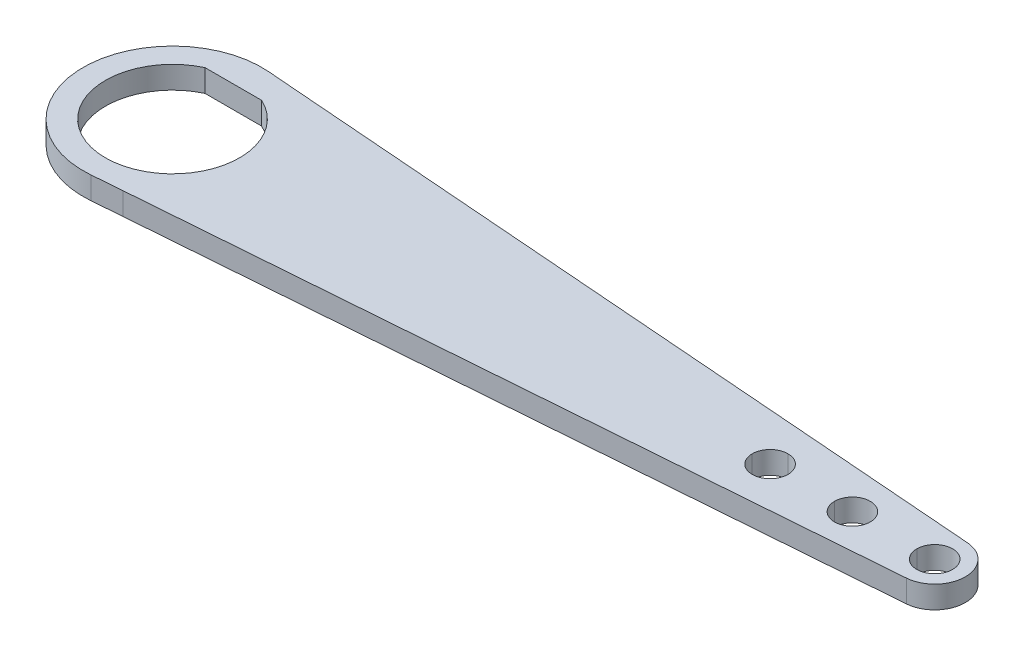
ISO-10303-21;
HEADER;
FILE_DESCRIPTION(('STEP AP214'),'2;1');
FILE_NAME('part.step','',(''),(''),'','','');
FILE_SCHEMA(('AUTOMOTIVE_DESIGN { 1 0 10303 214 1 1 1 1 }'));
ENDSEC;
DATA;
#1=APPLICATION_CONTEXT('core data for automotive mechanical design processes');
#2=APPLICATION_PROTOCOL_DEFINITION('international standard','automotive_design',2000,#1);
#3=PRODUCT_CONTEXT('',#1,'mechanical');
#4=PRODUCT('Part','Part','',(#3));
#5=PRODUCT_RELATED_PRODUCT_CATEGORY('part','',(#4));
#6=PRODUCT_DEFINITION_FORMATION('','',#4);
#7=PRODUCT_DEFINITION_CONTEXT('part definition',#1,'design');
#8=PRODUCT_DEFINITION('design','',#6,#7);
#9=PRODUCT_DEFINITION_SHAPE('','',#8);
#10=(LENGTH_UNIT() NAMED_UNIT(*) SI_UNIT(.MILLI.,.METRE.));
#11=(NAMED_UNIT(*) PLANE_ANGLE_UNIT() SI_UNIT($,.RADIAN.));
#12=(NAMED_UNIT(*) SI_UNIT($,.STERADIAN.) SOLID_ANGLE_UNIT());
#13=UNCERTAINTY_MEASURE_WITH_UNIT(LENGTH_MEASURE(1.E-05),#10,'distance_accuracy_value','');
#14=(GEOMETRIC_REPRESENTATION_CONTEXT(3) GLOBAL_UNCERTAINTY_ASSIGNED_CONTEXT((#13)) GLOBAL_UNIT_ASSIGNED_CONTEXT((#10,
#11,#12)) REPRESENTATION_CONTEXT('',''));
#15=CARTESIAN_POINT('',(0.,0.,0.));
#16=DIRECTION('',(0.,0.,1.));
#17=DIRECTION('',(1.,0.,0.));
#18=AXIS2_PLACEMENT_3D('',#15,#16,#17);
#19=CARTESIAN_POINT('',(84.836,3.175,0.));
#20=DIRECTION('',(0.,-1.,0.));
#21=DIRECTION('',(0.,0.,-1.));
#22=AXIS2_PLACEMENT_3D('',#19,#20,#21);
#23=CYLINDRICAL_SURFACE('',#22,2.54);
#24=CARTESIAN_POINT('',(84.836,0.,0.));
#25=DIRECTION('',(0.,1.,0.));
#26=DIRECTION('',(0.,0.,1.));
#27=AXIS2_PLACEMENT_3D('',#24,#25,#26);
#28=CIRCLE('',#27,2.54);
#29=CARTESIAN_POINT('',(84.836,0.,-2.54));
#30=VERTEX_POINT('',#29);
#31=CARTESIAN_POINT('',(82.296,0.,0.));
#32=VERTEX_POINT('',#31);
#33=EDGE_CURVE('E191',#30,#32,#28,.T.);
#34=ORIENTED_EDGE('',*,*,#33,.F.);
#35=DIRECTION('',(0.,-1.,0.));
#36=VECTOR('',#35,1.);
#37=CARTESIAN_POINT('',(84.836,3.175,-2.54));
#38=LINE('',#37,#36);
#39=CARTESIAN_POINT('',(84.836,3.175,-2.54));
#40=VERTEX_POINT('',#39);
#41=EDGE_CURVE('E11',#30,#40,#38,.F.);
#42=ORIENTED_EDGE('',*,*,#41,.T.);
#43=CARTESIAN_POINT('',(84.836,3.175,0.));
#44=DIRECTION('',(0.,1.,0.));
#45=DIRECTION('',(0.,0.,1.));
#46=AXIS2_PLACEMENT_3D('',#43,#44,#45);
#47=CIRCLE('',#46,2.54);
#48=CARTESIAN_POINT('',(82.296,3.175,0.));
#49=VERTEX_POINT('',#48);
#50=EDGE_CURVE('E185',#40,#49,#47,.T.);
#51=ORIENTED_EDGE('',*,*,#50,.T.);
#52=DIRECTION('',(0.,-1.,0.));
#53=VECTOR('',#52,1.);
#54=CARTESIAN_POINT('',(82.296,3.175,0.));
#55=LINE('',#54,#53);
#56=EDGE_CURVE('E259',#49,#32,#55,.T.);
#57=ORIENTED_EDGE('',*,*,#56,.T.);
#58=EDGE_LOOP('',(#34,#42,#51,#57));
#59=FACE_BOUND('',#58,.T.);
#60=ADVANCED_FACE('F49',(#59),#23,.F.);
#61=CARTESIAN_POINT('',(84.836,3.175,2.54));
#62=VERTEX_POINT('',#61);
#63=EDGE_CURVE('E186',#49,#62,#47,.T.);
#64=ORIENTED_EDGE('',*,*,#63,.T.);
#65=DIRECTION('',(0.,-1.,0.));
#66=VECTOR('',#65,1.);
#67=CARTESIAN_POINT('',(84.836,3.175,2.54));
#68=LINE('',#67,#66);
#69=CARTESIAN_POINT('',(84.836,0.,2.54));
#70=VERTEX_POINT('',#69);
#71=EDGE_CURVE('E58',#62,#70,#68,.T.);
#72=ORIENTED_EDGE('',*,*,#71,.T.);
#73=EDGE_CURVE('E192',#32,#70,#28,.T.);
#74=ORIENTED_EDGE('',*,*,#73,.F.);
#75=ORIENTED_EDGE('',*,*,#56,.F.);
#76=EDGE_LOOP('',(#64,#72,#74,#75));
#77=FACE_BOUND('',#76,.T.);
#78=ADVANCED_FACE('F281',(#77),#23,.F.);
#79=CARTESIAN_POINT('',(108.204,3.175,0.));
#80=DIRECTION('',(0.,-1.,0.));
#81=DIRECTION('',(0.,0.,-1.));
#82=AXIS2_PLACEMENT_3D('',#79,#80,#81);
#83=CYLINDRICAL_SURFACE('',#82,2.54);
#84=CARTESIAN_POINT('',(108.204,3.175,0.));
#85=DIRECTION('',(0.,1.,0.));
#86=DIRECTION('',(0.,0.,1.));
#87=AXIS2_PLACEMENT_3D('',#84,#85,#86);
#88=CIRCLE('',#87,2.54);
#89=CARTESIAN_POINT('',(110.744,3.175,0.));
#90=VERTEX_POINT('',#89);
#91=CARTESIAN_POINT('',(105.664,3.175,0.));
#92=VERTEX_POINT('',#91);
#93=EDGE_CURVE('E193',#90,#92,#88,.T.);
#94=ORIENTED_EDGE('',*,*,#93,.T.);
#95=DIRECTION('',(0.,-1.,0.));
#96=VECTOR('',#95,1.);
#97=CARTESIAN_POINT('',(105.664,3.175,0.));
#98=LINE('',#97,#96);
#99=CARTESIAN_POINT('',(105.664,0.,0.));
#100=VERTEX_POINT('',#99);
#101=EDGE_CURVE('E272',#92,#100,#98,.T.);
#102=ORIENTED_EDGE('',*,*,#101,.T.);
#103=CARTESIAN_POINT('',(108.204,0.,0.));
#104=DIRECTION('',(0.,1.,0.));
#105=DIRECTION('',(0.,0.,1.));
#106=AXIS2_PLACEMENT_3D('',#103,#104,#105);
#107=CIRCLE('',#106,2.54);
#108=CARTESIAN_POINT('',(110.744,0.,0.));
#109=VERTEX_POINT('',#108);
#110=EDGE_CURVE('E198',#109,#100,#107,.T.);
#111=ORIENTED_EDGE('',*,*,#110,.F.);
#112=DIRECTION('',(0.,-1.,0.));
#113=VECTOR('',#112,1.);
#114=CARTESIAN_POINT('',(110.744,3.175,0.));
#115=LINE('',#114,#113);
#116=EDGE_CURVE('E269',#109,#90,#115,.F.);
#117=ORIENTED_EDGE('',*,*,#116,.T.);
#118=EDGE_LOOP('',(#94,#102,#111,#117));
#119=FACE_BOUND('',#118,.T.);
#120=ADVANCED_FACE('F304',(#119),#83,.F.);
#121=CARTESIAN_POINT('',(96.52,3.175,0.));
#122=DIRECTION('',(0.,-1.,0.));
#123=DIRECTION('',(0.,0.,-1.));
#124=AXIS2_PLACEMENT_3D('',#121,#122,#123);
#125=CYLINDRICAL_SURFACE('',#124,2.54);
#126=CARTESIAN_POINT('',(96.52,3.175,0.));
#127=DIRECTION('',(0.,1.,0.));
#128=DIRECTION('',(0.,0.,1.));
#129=AXIS2_PLACEMENT_3D('',#126,#127,#128);
#130=CIRCLE('',#129,2.54);
#131=CARTESIAN_POINT('',(99.06,3.175,0.));
#132=VERTEX_POINT('',#131);
#133=CARTESIAN_POINT('',(93.98,3.175,0.));
#134=VERTEX_POINT('',#133);
#135=EDGE_CURVE('E201',#132,#134,#130,.T.);
#136=ORIENTED_EDGE('',*,*,#135,.T.);
#137=DIRECTION('',(0.,-1.,0.));
#138=VECTOR('',#137,1.);
#139=CARTESIAN_POINT('',(93.98,3.175,0.));
#140=LINE('',#139,#138);
#141=CARTESIAN_POINT('',(93.98,0.,0.));
#142=VERTEX_POINT('',#141);
#143=EDGE_CURVE('E266',#134,#142,#140,.T.);
#144=ORIENTED_EDGE('',*,*,#143,.T.);
#145=CARTESIAN_POINT('',(96.52,0.,0.));
#146=DIRECTION('',(0.,1.,0.));
#147=DIRECTION('',(0.,0.,1.));
#148=AXIS2_PLACEMENT_3D('',#145,#146,#147);
#149=CIRCLE('',#148,2.54);
#150=CARTESIAN_POINT('',(99.06,0.,0.));
#151=VERTEX_POINT('',#150);
#152=EDGE_CURVE('E206',#151,#142,#149,.T.);
#153=ORIENTED_EDGE('',*,*,#152,.F.);
#154=DIRECTION('',(0.,-1.,0.));
#155=VECTOR('',#154,1.);
#156=CARTESIAN_POINT('',(99.06,3.175,0.));
#157=LINE('',#156,#155);
#158=EDGE_CURVE('E263',#151,#132,#157,.F.);
#159=ORIENTED_EDGE('',*,*,#158,.T.);
#160=EDGE_LOOP('',(#136,#144,#153,#159));
#161=FACE_BOUND('',#160,.T.);
#162=ADVANCED_FACE('F297',(#161),#125,.F.);
#163=ORIENTED_EDGE('',*,*,#41,.F.);
#164=CARTESIAN_POINT('',(87.376,0.,0.));
#165=VERTEX_POINT('',#164);
#166=EDGE_CURVE('E187',#165,#30,#28,.T.);
#167=ORIENTED_EDGE('',*,*,#166,.F.);
#168=DIRECTION('',(0.,-1.,0.));
#169=VECTOR('',#168,1.);
#170=CARTESIAN_POINT('',(87.376,3.175,0.));
#171=LINE('',#170,#169);
#172=CARTESIAN_POINT('',(87.376,3.175,0.));
#173=VERTEX_POINT('',#172);
#174=EDGE_CURVE('E255',#165,#173,#171,.F.);
#175=ORIENTED_EDGE('',*,*,#174,.T.);
#176=EDGE_CURVE('E182',#173,#40,#47,.T.);
#177=ORIENTED_EDGE('',*,*,#176,.T.);
#178=EDGE_LOOP('',(#163,#167,#175,#177));
#179=FACE_BOUND('',#178,.T.);
#180=ADVANCED_FACE('F295',(#179),#23,.F.);
#181=CARTESIAN_POINT('',(61.7867275580791,3.175,-743.516676446642));
#182=DIRECTION('',(0.,-1.,0.));
#183=DIRECTION('',(0.,0.,-1.));
#184=AXIS2_PLACEMENT_3D('',#181,#182,#183);
#185=PLANE('',#184);
#186=ORIENTED_EDGE('',*,*,#176,.F.);
#187=EDGE_CURVE('E190',#62,#173,#47,.T.);
#188=ORIENTED_EDGE('',*,*,#187,.F.);
#189=ORIENTED_EDGE('',*,*,#63,.F.);
#190=ORIENTED_EDGE('',*,*,#50,.F.);
#191=EDGE_LOOP('',(#186,#188,#189,#190));
#192=FACE_BOUND('',#191,.T.);
#193=ORIENTED_EDGE('',*,*,#93,.F.);
#194=EDGE_CURVE('E197',#92,#90,#88,.T.);
#195=ORIENTED_EDGE('',*,*,#194,.F.);
#196=EDGE_LOOP('',(#193,#195));
#197=FACE_BOUND('',#196,.T.);
#198=ORIENTED_EDGE('',*,*,#135,.F.);
#199=EDGE_CURVE('E205',#134,#132,#130,.T.);
#200=ORIENTED_EDGE('',*,*,#199,.F.);
#201=EDGE_LOOP('',(#198,#200));
#202=FACE_BOUND('',#201,.T.);
#203=CARTESIAN_POINT('',(61.7867275580791,3.175,-743.516676446642));
#204=DIRECTION('',(0.,-1.,0.));
#205=DIRECTION('',(0.,0.,-1.));
#206=AXIS2_PLACEMENT_3D('',#203,#204,#205);
#207=CIRCLE('',#206,733.379518454029);
#208=CARTESIAN_POINT('',(5.26347748352501,3.175,-12.3185909124457));
#209=VERTEX_POINT('',#208);
#210=CARTESIAN_POINT('',(1.05175309143128,3.175,-12.6563744980409));
#211=VERTEX_POINT('',#210);
#212=EDGE_CURVE('E209',#209,#211,#207,.T.);
#213=ORIENTED_EDGE('',*,*,#212,.T.);
#214=CARTESIAN_POINT('',(0.,3.175,0.));
#215=DIRECTION('',(0.,1.,0.));
#216=DIRECTION('',(0.,0.,-1.));
#217=AXIS2_PLACEMENT_3D('',#214,#215,#216);
#218=CIRCLE('',#217,12.6999999999998);
#219=CARTESIAN_POINT('',(1.05175309143161,3.175,12.656374498041));
#220=VERTEX_POINT('',#219);
#221=EDGE_CURVE('E212',#211,#220,#218,.T.);
#222=ORIENTED_EDGE('',*,*,#221,.T.);
#223=CARTESIAN_POINT('',(61.7867275580791,3.175,743.516676446642));
#224=DIRECTION('',(0.,-1.,0.));
#225=DIRECTION('',(0.,0.,1.));
#226=AXIS2_PLACEMENT_3D('',#223,#224,#225);
#227=CIRCLE('',#226,733.379518454029);
#228=CARTESIAN_POINT('',(5.26347748352501,3.175,12.3185909124457));
#229=VERTEX_POINT('',#228);
#230=EDGE_CURVE('E215',#220,#229,#227,.T.);
#231=ORIENTED_EDGE('',*,*,#230,.T.);
#232=DIRECTION('',(0.997025506078446,0.,-0.0770723052011415));
#233=VECTOR('',#232,1.);
#234=CARTESIAN_POINT('',(108.539117008897,3.175,4.33515261441251));
#235=LINE('',#234,#233);
#236=CARTESIAN_POINT('',(108.539117008897,3.175,4.33515261441251));
#237=VERTEX_POINT('',#236);
#238=EDGE_CURVE('E217',#229,#237,#235,.T.);
#239=ORIENTED_EDGE('',*,*,#238,.T.);
#240=CARTESIAN_POINT('',(108.204,3.175,0.));
#241=DIRECTION('',(0.,1.,0.));
#242=DIRECTION('',(0.,0.,-1.));
#243=AXIS2_PLACEMENT_3D('',#240,#241,#242);
#244=CIRCLE('',#243,4.34808596969977);
#245=CARTESIAN_POINT('',(108.539117008897,3.175,-4.33515261441251));
#246=VERTEX_POINT('',#245);
#247=EDGE_CURVE('E219',#237,#246,#244,.T.);
#248=ORIENTED_EDGE('',*,*,#247,.T.);
#249=DIRECTION('',(-0.997025506078446,0.,-0.0770723052011415));
#250=VECTOR('',#249,1.);
#251=CARTESIAN_POINT('',(108.539117008897,3.175,-4.33515261441251));
#252=LINE('',#251,#250);
#253=EDGE_CURVE('E221',#246,#209,#252,.T.);
#254=ORIENTED_EDGE('',*,*,#253,.T.);
#255=EDGE_LOOP('',(#213,#222,#231,#239,#248,#254));
#256=FACE_BOUND('',#255,.T.);
#257=CARTESIAN_POINT('',(0.,3.175,0.));
#258=DIRECTION('',(0.,1.,0.));
#259=DIRECTION('',(0.,0.,-1.));
#260=AXIS2_PLACEMENT_3D('',#257,#258,#259);
#261=CIRCLE('',#260,9.525);
#262=CARTESIAN_POINT('',(-4.01810017296732,3.175,-8.636));
#263=VERTEX_POINT('',#262);
#264=CARTESIAN_POINT('',(4.01810017296732,3.175,-8.63599999999998));
#265=VERTEX_POINT('',#264);
#266=EDGE_CURVE('E169',#263,#265,#261,.T.);
#267=ORIENTED_EDGE('',*,*,#266,.F.);
#268=DIRECTION('',(-1.,0.,0.));
#269=VECTOR('',#268,1.);
#270=CARTESIAN_POINT('',(-4.01810017296732,3.175,-8.636));
#271=LINE('',#270,#269);
#272=EDGE_CURVE('E159',#265,#263,#271,.T.);
#273=ORIENTED_EDGE('',*,*,#272,.F.);
#274=EDGE_LOOP('',(#267,#273));
#275=FACE_BOUND('',#274,.T.);
#276=ADVANCED_FACE('F177',(#192,#197,#202,#256,#275),#185,.F.);
#277=CARTESIAN_POINT('',(61.7867275580791,0.,-743.516676446642));
#278=DIRECTION('',(0.,-1.,0.));
#279=DIRECTION('',(0.,0.,-1.));
#280=AXIS2_PLACEMENT_3D('',#277,#278,#279);
#281=PLANE('',#280);
#282=ORIENTED_EDGE('',*,*,#110,.T.);
#283=EDGE_CURVE('E184',#100,#109,#107,.T.);
#284=ORIENTED_EDGE('',*,*,#283,.T.);
#285=EDGE_LOOP('',(#282,#284));
#286=FACE_BOUND('',#285,.T.);
#287=CARTESIAN_POINT('',(61.7867275580791,0.,-743.516676446642));
#288=DIRECTION('',(0.,-1.,0.));
#289=DIRECTION('',(0.,0.,-1.));
#290=AXIS2_PLACEMENT_3D('',#287,#288,#289);
#291=CIRCLE('',#290,733.379518454029);
#292=CARTESIAN_POINT('',(5.26347748352501,0.,-12.3185909124457));
#293=VERTEX_POINT('',#292);
#294=CARTESIAN_POINT('',(1.05175309143128,0.,-12.6563744980409));
#295=VERTEX_POINT('',#294);
#296=EDGE_CURVE('E204',#293,#295,#291,.T.);
#297=ORIENTED_EDGE('',*,*,#296,.F.);
#298=DIRECTION('',(-0.997025506078446,0.,-0.0770723052011415));
#299=VECTOR('',#298,1.);
#300=CARTESIAN_POINT('',(108.539117008897,0.,-4.33515261441251));
#301=LINE('',#300,#299);
#302=CARTESIAN_POINT('',(108.539117008897,0.,-4.33515261441251));
#303=VERTEX_POINT('',#302);
#304=EDGE_CURVE('E213',#303,#293,#301,.T.);
#305=ORIENTED_EDGE('',*,*,#304,.F.);
#306=CARTESIAN_POINT('',(108.204,0.,0.));
#307=DIRECTION('',(0.,1.,0.));
#308=DIRECTION('',(0.,0.,-1.));
#309=AXIS2_PLACEMENT_3D('',#306,#307,#308);
#310=CIRCLE('',#309,4.34808596969977);
#311=CARTESIAN_POINT('',(108.539117008897,0.,4.33515261441251));
#312=VERTEX_POINT('',#311);
#313=EDGE_CURVE('E232',#312,#303,#310,.T.);
#314=ORIENTED_EDGE('',*,*,#313,.F.);
#315=DIRECTION('',(0.997025506078446,0.,-0.0770723052011415));
#316=VECTOR('',#315,1.);
#317=CARTESIAN_POINT('',(108.539117008897,0.,4.33515261441251));
#318=LINE('',#317,#316);
#319=CARTESIAN_POINT('',(5.26347748352501,0.,12.3185909124457));
#320=VERTEX_POINT('',#319);
#321=EDGE_CURVE('E230',#320,#312,#318,.T.);
#322=ORIENTED_EDGE('',*,*,#321,.F.);
#323=CARTESIAN_POINT('',(61.7867275580791,0.,743.516676446642));
#324=DIRECTION('',(0.,-1.,0.));
#325=DIRECTION('',(0.,0.,1.));
#326=AXIS2_PLACEMENT_3D('',#323,#324,#325);
#327=CIRCLE('',#326,733.379518454029);
#328=CARTESIAN_POINT('',(1.05175309143161,0.,12.656374498041));
#329=VERTEX_POINT('',#328);
#330=EDGE_CURVE('E228',#329,#320,#327,.T.);
#331=ORIENTED_EDGE('',*,*,#330,.F.);
#332=CARTESIAN_POINT('',(0.,0.,0.));
#333=DIRECTION('',(0.,1.,0.));
#334=DIRECTION('',(0.,0.,-1.));
#335=AXIS2_PLACEMENT_3D('',#332,#333,#334);
#336=CIRCLE('',#335,12.6999999999998);
#337=EDGE_CURVE('E226',#295,#329,#336,.T.);
#338=ORIENTED_EDGE('',*,*,#337,.F.);
#339=EDGE_LOOP('',(#297,#305,#314,#322,#331,#338));
#340=FACE_BOUND('',#339,.T.);
#341=ORIENTED_EDGE('',*,*,#152,.T.);
#342=EDGE_CURVE('E196',#142,#151,#149,.T.);
#343=ORIENTED_EDGE('',*,*,#342,.T.);
#344=EDGE_LOOP('',(#341,#343));
#345=FACE_BOUND('',#344,.T.);
#346=ORIENTED_EDGE('',*,*,#166,.T.);
#347=ORIENTED_EDGE('',*,*,#33,.T.);
#348=ORIENTED_EDGE('',*,*,#73,.T.);
#349=EDGE_CURVE('E180',#70,#165,#28,.T.);
#350=ORIENTED_EDGE('',*,*,#349,.T.);
#351=EDGE_LOOP('',(#346,#347,#348,#350));
#352=FACE_BOUND('',#351,.T.);
#353=DIRECTION('',(1.,0.,0.));
#354=VECTOR('',#353,1.);
#355=CARTESIAN_POINT('',(61.7867275580791,0.,-8.63599999999998));
#356=LINE('',#355,#354);
#357=CARTESIAN_POINT('',(4.01810017296735,0.,-8.63599999999999));
#358=VERTEX_POINT('',#357);
#359=CARTESIAN_POINT('',(-4.01810017296735,0.,-8.63599999999999));
#360=VERTEX_POINT('',#359);
#361=EDGE_CURVE('E252',#358,#360,#356,.F.);
#362=ORIENTED_EDGE('',*,*,#361,.T.);
#363=CARTESIAN_POINT('',(0.,0.,0.));
#364=DIRECTION('',(0.,-1.,0.));
#365=DIRECTION('',(0.,0.,-1.));
#366=AXIS2_PLACEMENT_3D('',#363,#364,#365);
#367=CIRCLE('',#366,9.525);
#368=EDGE_CURVE('E174',#360,#358,#367,.F.);
#369=ORIENTED_EDGE('',*,*,#368,.T.);
#370=EDGE_LOOP('',(#362,#369));
#371=FACE_BOUND('',#370,.T.);
#372=ADVANCED_FACE('F290',(#286,#340,#345,#352,#371),#281,.T.);
#373=CARTESIAN_POINT('',(61.7867275580791,3.175,-743.516676446642));
#374=DIRECTION('',(0.,-1.,0.));
#375=DIRECTION('',(0.,0.,-1.));
#376=AXIS2_PLACEMENT_3D('',#373,#374,#375);
#377=CYLINDRICAL_SURFACE('',#376,733.379518454029);
#378=ORIENTED_EDGE('',*,*,#296,.T.);
#379=DIRECTION('',(0.,-1.,0.));
#380=VECTOR('',#379,1.);
#381=CARTESIAN_POINT('',(1.05175309143128,3.175,-12.6563744980409));
#382=LINE('',#381,#380);
#383=EDGE_CURVE('E249',#211,#295,#382,.T.);
#384=ORIENTED_EDGE('',*,*,#383,.F.);
#385=ORIENTED_EDGE('',*,*,#212,.F.);
#386=DIRECTION('',(0.,-1.,0.));
#387=VECTOR('',#386,1.);
#388=CARTESIAN_POINT('',(5.26347748352501,3.175,-12.3185909124457));
#389=LINE('',#388,#387);
#390=EDGE_CURVE('E223',#209,#293,#389,.T.);
#391=ORIENTED_EDGE('',*,*,#390,.T.);
#392=EDGE_LOOP('',(#378,#384,#385,#391));
#393=FACE_BOUND('',#392,.T.);
#394=ADVANCED_FACE('F51',(#393),#377,.F.);
#395=CARTESIAN_POINT('',(0.,3.175,0.));
#396=DIRECTION('',(0.,-1.,0.));
#397=DIRECTION('',(0.,0.,-1.));
#398=AXIS2_PLACEMENT_3D('',#395,#396,#397);
#399=CYLINDRICAL_SURFACE('',#398,12.6999999999998);
#400=ORIENTED_EDGE('',*,*,#337,.T.);
#401=DIRECTION('',(0.,-1.,0.));
#402=VECTOR('',#401,1.);
#403=CARTESIAN_POINT('',(1.05175309143161,3.175,12.656374498041));
#404=LINE('',#403,#402);
#405=EDGE_CURVE('E246',#220,#329,#404,.T.);
#406=ORIENTED_EDGE('',*,*,#405,.F.);
#407=ORIENTED_EDGE('',*,*,#221,.F.);
#408=ORIENTED_EDGE('',*,*,#383,.T.);
#409=EDGE_LOOP('',(#400,#406,#407,#408));
#410=FACE_BOUND('',#409,.T.);
#411=ADVANCED_FACE('F453',(#410),#399,.T.);
#412=CARTESIAN_POINT('',(61.7867275580791,3.175,743.516676446642));
#413=DIRECTION('',(0.,-1.,0.));
#414=DIRECTION('',(0.,0.,-1.));
#415=AXIS2_PLACEMENT_3D('',#412,#413,#414);
#416=CYLINDRICAL_SURFACE('',#415,733.379518454029);
#417=ORIENTED_EDGE('',*,*,#330,.T.);
#418=DIRECTION('',(0.,-1.,0.));
#419=VECTOR('',#418,1.);
#420=CARTESIAN_POINT('',(5.26347748352501,3.175,12.3185909124457));
#421=LINE('',#420,#419);
#422=EDGE_CURVE('E243',#229,#320,#421,.T.);
#423=ORIENTED_EDGE('',*,*,#422,.F.);
#424=ORIENTED_EDGE('',*,*,#230,.F.);
#425=ORIENTED_EDGE('',*,*,#405,.T.);
#426=EDGE_LOOP('',(#417,#423,#424,#425));
#427=FACE_BOUND('',#426,.T.);
#428=ADVANCED_FACE('F444',(#427),#416,.F.);
#429=CARTESIAN_POINT('',(108.539117008897,3.175,4.33515261441251));
#430=DIRECTION('',(-0.0770723052011415,0.,-0.997025506078446));
#431=DIRECTION('',(-0.997025506078447,0.,0.0770723052011415));
#432=AXIS2_PLACEMENT_3D('',#429,#430,#431);
#433=PLANE('',#432);
#434=ORIENTED_EDGE('',*,*,#321,.T.);
#435=DIRECTION('',(0.,-1.,0.));
#436=VECTOR('',#435,1.);
#437=CARTESIAN_POINT('',(108.539117008897,3.175,4.33515261441251));
#438=LINE('',#437,#436);
#439=EDGE_CURVE('E240',#237,#312,#438,.T.);
#440=ORIENTED_EDGE('',*,*,#439,.F.);
#441=ORIENTED_EDGE('',*,*,#238,.F.);
#442=ORIENTED_EDGE('',*,*,#422,.T.);
#443=EDGE_LOOP('',(#434,#440,#441,#442));
#444=FACE_BOUND('',#443,.T.);
#445=ADVANCED_FACE('F435',(#444),#433,.F.);
#446=CARTESIAN_POINT('',(108.204,3.175,0.));
#447=DIRECTION('',(0.,-1.,0.));
#448=DIRECTION('',(0.,0.,-1.));
#449=AXIS2_PLACEMENT_3D('',#446,#447,#448);
#450=CYLINDRICAL_SURFACE('',#449,4.34808596969977);
#451=ORIENTED_EDGE('',*,*,#313,.T.);
#452=DIRECTION('',(0.,-1.,0.));
#453=VECTOR('',#452,1.);
#454=CARTESIAN_POINT('',(108.539117008897,3.175,-4.33515261441251));
#455=LINE('',#454,#453);
#456=EDGE_CURVE('E237',#246,#303,#455,.T.);
#457=ORIENTED_EDGE('',*,*,#456,.F.);
#458=ORIENTED_EDGE('',*,*,#247,.F.);
#459=ORIENTED_EDGE('',*,*,#439,.T.);
#460=EDGE_LOOP('',(#451,#457,#458,#459));
#461=FACE_BOUND('',#460,.T.);
#462=ADVANCED_FACE('F427',(#461),#450,.T.);
#463=CARTESIAN_POINT('',(108.539117008897,3.175,-4.33515261441251));
#464=DIRECTION('',(-0.0770723052011415,0.,0.997025506078446));
#465=DIRECTION('',(0.997025506078447,0.,0.0770723052011415));
#466=AXIS2_PLACEMENT_3D('',#463,#464,#465);
#467=PLANE('',#466);
#468=ORIENTED_EDGE('',*,*,#304,.T.);
#469=ORIENTED_EDGE('',*,*,#390,.F.);
#470=ORIENTED_EDGE('',*,*,#253,.F.);
#471=ORIENTED_EDGE('',*,*,#456,.T.);
#472=EDGE_LOOP('',(#468,#469,#470,#471));
#473=FACE_BOUND('',#472,.T.);
#474=ADVANCED_FACE('F357',(#473),#467,.F.);
#475=ORIENTED_EDGE('',*,*,#143,.F.);
#476=ORIENTED_EDGE('',*,*,#199,.T.);
#477=ORIENTED_EDGE('',*,*,#158,.F.);
#478=ORIENTED_EDGE('',*,*,#342,.F.);
#479=EDGE_LOOP('',(#475,#476,#477,#478));
#480=FACE_BOUND('',#479,.T.);
#481=ADVANCED_FACE('F307',(#480),#125,.F.);
#482=ORIENTED_EDGE('',*,*,#101,.F.);
#483=ORIENTED_EDGE('',*,*,#194,.T.);
#484=ORIENTED_EDGE('',*,*,#116,.F.);
#485=ORIENTED_EDGE('',*,*,#283,.F.);
#486=EDGE_LOOP('',(#482,#483,#484,#485));
#487=FACE_BOUND('',#486,.T.);
#488=ADVANCED_FACE('F311',(#487),#83,.F.);
#489=ORIENTED_EDGE('',*,*,#71,.F.);
#490=ORIENTED_EDGE('',*,*,#187,.T.);
#491=ORIENTED_EDGE('',*,*,#174,.F.);
#492=ORIENTED_EDGE('',*,*,#349,.F.);
#493=EDGE_LOOP('',(#489,#490,#491,#492));
#494=FACE_BOUND('',#493,.T.);
#495=ADVANCED_FACE('F288',(#494),#23,.F.);
#496=CARTESIAN_POINT('',(0.,3.175,0.));
#497=DIRECTION('',(0.,-1.,0.));
#498=DIRECTION('',(0.,0.,-1.));
#499=AXIS2_PLACEMENT_3D('',#496,#497,#498);
#500=CYLINDRICAL_SURFACE('',#499,9.525);
#501=DIRECTION('',(0.,-1.,0.));
#502=VECTOR('',#501,1.);
#503=CARTESIAN_POINT('',(-4.01810017296732,3.175,-8.636));
#504=LINE('',#503,#502);
#505=EDGE_CURVE('E162',#263,#360,#504,.T.);
#506=ORIENTED_EDGE('',*,*,#505,.F.);
#507=ORIENTED_EDGE('',*,*,#266,.T.);
#508=DIRECTION('',(0.,-1.,0.));
#509=VECTOR('',#508,1.);
#510=CARTESIAN_POINT('',(4.01810017296732,3.175,-8.636));
#511=LINE('',#510,#509);
#512=EDGE_CURVE('E165',#265,#358,#511,.T.);
#513=ORIENTED_EDGE('',*,*,#512,.T.);
#514=ORIENTED_EDGE('',*,*,#368,.F.);
#515=EDGE_LOOP('',(#506,#507,#513,#514));
#516=FACE_BOUND('',#515,.T.);
#517=ADVANCED_FACE('F172',(#516),#500,.F.);
#518=CARTESIAN_POINT('',(-4.01810017296732,3.175,-8.636));
#519=DIRECTION('',(0.,0.,1.));
#520=DIRECTION('',(1.,0.,0.));
#521=AXIS2_PLACEMENT_3D('',#518,#519,#520);
#522=PLANE('',#521);
#523=ORIENTED_EDGE('',*,*,#512,.F.);
#524=ORIENTED_EDGE('',*,*,#272,.T.);
#525=ORIENTED_EDGE('',*,*,#505,.T.);
#526=ORIENTED_EDGE('',*,*,#361,.F.);
#527=EDGE_LOOP('',(#523,#524,#525,#526));
#528=FACE_BOUND('',#527,.T.);
#529=ADVANCED_FACE('F161',(#528),#522,.T.);
#530=CLOSED_SHELL('',(#60,#78,#120,#162,#180,#276,#372,#394,#411,#428,#445,#462,#474,#481,#488,
#495,#517,#529));
#531=MANIFOLD_SOLID_BREP('B2',#530);
#532=ADVANCED_BREP_SHAPE_REPRESENTATION('',(#18,#531),#14);
#533=SHAPE_DEFINITION_REPRESENTATION(#9,#532);
ENDSEC;
END-ISO-10303-21;
